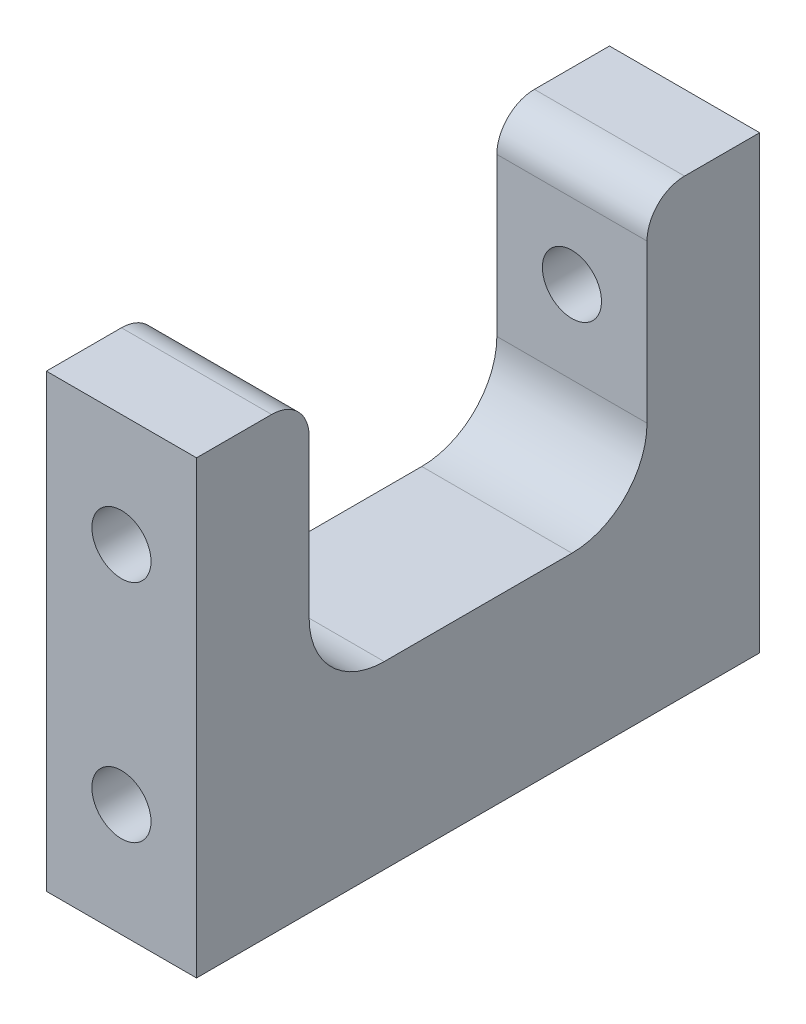
ISO-10303-21;
HEADER;
FILE_DESCRIPTION(('STEP AP214'),'2;1');
FILE_NAME('part.step','',(''),(''),'','','');
FILE_SCHEMA(('AUTOMOTIVE_DESIGN { 1 0 10303 214 1 1 1 1 }'));
ENDSEC;
DATA;
#1=APPLICATION_CONTEXT('core data for automotive mechanical design processes');
#2=APPLICATION_PROTOCOL_DEFINITION('international standard','automotive_design',2000,#1);
#3=PRODUCT_CONTEXT('',#1,'mechanical');
#4=PRODUCT('Part','Part','',(#3));
#5=PRODUCT_RELATED_PRODUCT_CATEGORY('part','',(#4));
#6=PRODUCT_DEFINITION_FORMATION('','',#4);
#7=PRODUCT_DEFINITION_CONTEXT('part definition',#1,'design');
#8=PRODUCT_DEFINITION('design','',#6,#7);
#9=PRODUCT_DEFINITION_SHAPE('','',#8);
#10=(LENGTH_UNIT() NAMED_UNIT(*) SI_UNIT(.MILLI.,.METRE.));
#11=(NAMED_UNIT(*) PLANE_ANGLE_UNIT() SI_UNIT($,.RADIAN.));
#12=(NAMED_UNIT(*) SI_UNIT($,.STERADIAN.) SOLID_ANGLE_UNIT());
#13=UNCERTAINTY_MEASURE_WITH_UNIT(LENGTH_MEASURE(1.E-05),#10,'distance_accuracy_value','');
#14=(GEOMETRIC_REPRESENTATION_CONTEXT(3) GLOBAL_UNCERTAINTY_ASSIGNED_CONTEXT((#13)) GLOBAL_UNIT_ASSIGNED_CONTEXT((#10,
#11,#12)) REPRESENTATION_CONTEXT('',''));
#15=CARTESIAN_POINT('',(0.,0.,0.));
#16=DIRECTION('',(0.,0.,1.));
#17=DIRECTION('',(1.,0.,0.));
#18=AXIS2_PLACEMENT_3D('',#15,#16,#17);
#19=CARTESIAN_POINT('',(-3.175,9.525,23.8125));
#20=DIRECTION('',(0.,-1.,0.));
#21=DIRECTION('',(0.,0.,-1.));
#22=AXIS2_PLACEMENT_3D('',#19,#20,#21);
#23=PLANE('',#22);
#24=DIRECTION('',(0.,0.,-1.));
#25=VECTOR('',#24,1.);
#26=CARTESIAN_POINT('',(3.175,9.525,23.8125));
#27=LINE('',#26,#25);
#28=CARTESIAN_POINT('',(3.175,9.525,23.8125));
#29=VERTEX_POINT('',#28);
#30=CARTESIAN_POINT('',(3.175,9.525,20.6375));
#31=VERTEX_POINT('',#30);
#32=EDGE_CURVE('E207',#29,#31,#27,.T.);
#33=ORIENTED_EDGE('',*,*,#32,.T.);
#34=DIRECTION('',(1.,0.,0.));
#35=VECTOR('',#34,1.);
#36=CARTESIAN_POINT('',(-3.175,9.525,20.6375));
#37=LINE('',#36,#35);
#38=CARTESIAN_POINT('',(-3.175,9.525,20.6375));
#39=VERTEX_POINT('',#38);
#40=EDGE_CURVE('E237',#31,#39,#37,.F.);
#41=ORIENTED_EDGE('',*,*,#40,.T.);
#42=DIRECTION('',(0.,0.,-1.));
#43=VECTOR('',#42,1.);
#44=CARTESIAN_POINT('',(-3.175,9.525,23.8125));
#45=LINE('',#44,#43);
#46=CARTESIAN_POINT('',(-3.175,9.525,23.8125));
#47=VERTEX_POINT('',#46);
#48=EDGE_CURVE('E203',#47,#39,#45,.T.);
#49=ORIENTED_EDGE('',*,*,#48,.F.);
#50=DIRECTION('',(-1.,0.,0.));
#51=VECTOR('',#50,1.);
#52=CARTESIAN_POINT('',(-3.175,9.525,23.8125));
#53=LINE('',#52,#51);
#54=EDGE_CURVE('E181',#29,#47,#53,.T.);
#55=ORIENTED_EDGE('',*,*,#54,.F.);
#56=EDGE_LOOP('',(#33,#41,#49,#55));
#57=FACE_BOUND('',#56,.T.);
#58=ADVANCED_FACE('F37',(#57),#23,.F.);
#59=CARTESIAN_POINT('',(3.175,-9.525,23.8125));
#60=DIRECTION('',(-1.,0.,0.));
#61=DIRECTION('',(0.,0.,1.));
#62=AXIS2_PLACEMENT_3D('',#59,#60,#61);
#63=PLANE('',#62);
#64=DIRECTION('',(0.,-1.,0.));
#65=VECTOR('',#64,1.);
#66=CARTESIAN_POINT('',(3.175,9.525,19.05));
#67=LINE('',#66,#65);
#68=CARTESIAN_POINT('',(3.175,7.9375,19.05));
#69=VERTEX_POINT('',#68);
#70=CARTESIAN_POINT('',(3.175,1.27,19.05));
#71=VERTEX_POINT('',#70);
#72=EDGE_CURVE('E163',#69,#71,#67,.T.);
#73=ORIENTED_EDGE('',*,*,#72,.F.);
#74=CARTESIAN_POINT('',(3.175,7.9375,20.6375));
#75=DIRECTION('',(-1.,0.,0.));
#76=DIRECTION('',(0.,0.,1.));
#77=AXIS2_PLACEMENT_3D('',#74,#75,#76);
#78=CIRCLE('',#77,1.5875);
#79=EDGE_CURVE('E235',#69,#31,#78,.F.);
#80=ORIENTED_EDGE('',*,*,#79,.T.);
#81=ORIENTED_EDGE('',*,*,#32,.F.);
#82=DIRECTION('',(0.,1.,0.));
#83=VECTOR('',#82,1.);
#84=CARTESIAN_POINT('',(3.175,-9.525,23.8125));
#85=LINE('',#84,#83);
#86=CARTESIAN_POINT('',(3.175,-9.525,23.8125));
#87=VERTEX_POINT('',#86);
#88=EDGE_CURVE('E178',#87,#29,#85,.T.);
#89=ORIENTED_EDGE('',*,*,#88,.F.);
#90=DIRECTION('',(0.,0.,-1.));
#91=VECTOR('',#90,1.);
#92=CARTESIAN_POINT('',(3.175,-9.525,23.8125));
#93=LINE('',#92,#91);
#94=CARTESIAN_POINT('',(3.175,-9.525,0.));
#95=VERTEX_POINT('',#94);
#96=EDGE_CURVE('E188',#87,#95,#93,.T.);
#97=ORIENTED_EDGE('',*,*,#96,.T.);
#98=DIRECTION('',(0.,1.,0.));
#99=VECTOR('',#98,1.);
#100=CARTESIAN_POINT('',(3.175,-9.525,0.));
#101=LINE('',#100,#99);
#102=CARTESIAN_POINT('',(3.175,9.525,0.));
#103=VERTEX_POINT('',#102);
#104=EDGE_CURVE('E172',#95,#103,#101,.T.);
#105=ORIENTED_EDGE('',*,*,#104,.T.);
#106=CARTESIAN_POINT('',(3.175,9.525,3.175));
#107=VERTEX_POINT('',#106);
#108=EDGE_CURVE('E206',#107,#103,#27,.T.);
#109=ORIENTED_EDGE('',*,*,#108,.F.);
#110=CARTESIAN_POINT('',(3.175,7.9375,3.175));
#111=DIRECTION('',(-1.,0.,0.));
#112=DIRECTION('',(0.,0.,1.));
#113=AXIS2_PLACEMENT_3D('',#110,#111,#112);
#114=CIRCLE('',#113,1.5875);
#115=CARTESIAN_POINT('',(3.175,7.9375,4.7625));
#116=VERTEX_POINT('',#115);
#117=EDGE_CURVE('E233',#107,#116,#114,.F.);
#118=ORIENTED_EDGE('',*,*,#117,.T.);
#119=DIRECTION('',(0.,1.,0.));
#120=VECTOR('',#119,1.);
#121=CARTESIAN_POINT('',(3.175,9.525,4.7625));
#122=LINE('',#121,#120);
#123=CARTESIAN_POINT('',(3.175,1.27,4.7625));
#124=VERTEX_POINT('',#123);
#125=EDGE_CURVE('E167',#124,#116,#122,.T.);
#126=ORIENTED_EDGE('',*,*,#125,.F.);
#127=CARTESIAN_POINT('',(3.175,1.27,7.9375));
#128=DIRECTION('',(-1.,0.,0.));
#129=DIRECTION('',(0.,0.,1.));
#130=AXIS2_PLACEMENT_3D('',#127,#128,#129);
#131=CIRCLE('',#130,3.175);
#132=CARTESIAN_POINT('',(3.175,-1.905,7.9375));
#133=VERTEX_POINT('',#132);
#134=EDGE_CURVE('E226',#124,#133,#131,.T.);
#135=ORIENTED_EDGE('',*,*,#134,.T.);
#136=DIRECTION('',(0.,0.,-1.));
#137=VECTOR('',#136,1.);
#138=CARTESIAN_POINT('',(3.175,-1.905,19.05));
#139=LINE('',#138,#137);
#140=CARTESIAN_POINT('',(3.175,-1.905,15.875));
#141=VERTEX_POINT('',#140);
#142=EDGE_CURVE('E174',#141,#133,#139,.T.);
#143=ORIENTED_EDGE('',*,*,#142,.F.);
#144=CARTESIAN_POINT('',(3.175,1.27,15.875));
#145=DIRECTION('',(-1.,0.,0.));
#146=DIRECTION('',(0.,0.,1.));
#147=AXIS2_PLACEMENT_3D('',#144,#145,#146);
#148=CIRCLE('',#147,3.175);
#149=EDGE_CURVE('E221',#141,#71,#148,.T.);
#150=ORIENTED_EDGE('',*,*,#149,.T.);
#151=EDGE_LOOP('',(#73,#80,#81,#89,#97,#105,#109,#118,#126,#135,#143,#150));
#152=FACE_BOUND('',#151,.T.);
#153=ADVANCED_FACE('F250',(#152),#63,.F.);
#154=CARTESIAN_POINT('',(-3.175,9.525,3.175));
#155=VERTEX_POINT('',#154);
#156=CARTESIAN_POINT('',(-3.175,9.525,0.));
#157=VERTEX_POINT('',#156);
#158=EDGE_CURVE('E202',#155,#157,#45,.T.);
#159=ORIENTED_EDGE('',*,*,#158,.F.);
#160=DIRECTION('',(1.,0.,0.));
#161=VECTOR('',#160,1.);
#162=CARTESIAN_POINT('',(-3.175,9.525,3.175));
#163=LINE('',#162,#161);
#164=EDGE_CURVE('E45',#155,#107,#163,.T.);
#165=ORIENTED_EDGE('',*,*,#164,.T.);
#166=ORIENTED_EDGE('',*,*,#108,.T.);
#167=DIRECTION('',(-1.,0.,0.));
#168=VECTOR('',#167,1.);
#169=CARTESIAN_POINT('',(-3.175,9.525,0.));
#170=LINE('',#169,#168);
#171=EDGE_CURVE('E191',#103,#157,#170,.T.);
#172=ORIENTED_EDGE('',*,*,#171,.T.);
#173=EDGE_LOOP('',(#159,#165,#166,#172));
#174=FACE_BOUND('',#173,.T.);
#175=ADVANCED_FACE('F245',(#174),#23,.F.);
#176=CARTESIAN_POINT('',(-3.175,-9.525,23.8125));
#177=DIRECTION('',(1.,0.,0.));
#178=DIRECTION('',(0.,0.,-1.));
#179=AXIS2_PLACEMENT_3D('',#176,#177,#178);
#180=PLANE('',#179);
#181=ORIENTED_EDGE('',*,*,#48,.T.);
#182=CARTESIAN_POINT('',(-3.175,7.9375,20.6375));
#183=DIRECTION('',(1.,0.,0.));
#184=DIRECTION('',(0.,0.,-1.));
#185=AXIS2_PLACEMENT_3D('',#182,#183,#184);
#186=CIRCLE('',#185,1.5875);
#187=CARTESIAN_POINT('',(-3.175,7.9375,19.05));
#188=VERTEX_POINT('',#187);
#189=EDGE_CURVE('E240',#39,#188,#186,.F.);
#190=ORIENTED_EDGE('',*,*,#189,.T.);
#191=DIRECTION('',(0.,-1.,0.));
#192=VECTOR('',#191,1.);
#193=CARTESIAN_POINT('',(-3.175,9.525,19.05));
#194=LINE('',#193,#192);
#195=CARTESIAN_POINT('',(-3.175,1.27,19.05));
#196=VERTEX_POINT('',#195);
#197=EDGE_CURVE('E164',#188,#196,#194,.T.);
#198=ORIENTED_EDGE('',*,*,#197,.T.);
#199=CARTESIAN_POINT('',(-3.175,1.27,15.875));
#200=DIRECTION('',(1.,0.,0.));
#201=DIRECTION('',(0.,0.,-1.));
#202=AXIS2_PLACEMENT_3D('',#199,#200,#201);
#203=CIRCLE('',#202,3.175);
#204=CARTESIAN_POINT('',(-3.175,-1.905,15.875));
#205=VERTEX_POINT('',#204);
#206=EDGE_CURVE('E224',#196,#205,#203,.T.);
#207=ORIENTED_EDGE('',*,*,#206,.T.);
#208=DIRECTION('',(0.,0.,-1.));
#209=VECTOR('',#208,1.);
#210=CARTESIAN_POINT('',(-3.175,-1.905,19.05));
#211=LINE('',#210,#209);
#212=CARTESIAN_POINT('',(-3.175,-1.905,7.9375));
#213=VERTEX_POINT('',#212);
#214=EDGE_CURVE('E166',#205,#213,#211,.T.);
#215=ORIENTED_EDGE('',*,*,#214,.T.);
#216=CARTESIAN_POINT('',(-3.175,1.27,7.9375));
#217=DIRECTION('',(1.,0.,0.));
#218=DIRECTION('',(0.,0.,-1.));
#219=AXIS2_PLACEMENT_3D('',#216,#217,#218);
#220=CIRCLE('',#219,3.175);
#221=CARTESIAN_POINT('',(-3.175,1.27,4.7625));
#222=VERTEX_POINT('',#221);
#223=EDGE_CURVE('E228',#213,#222,#220,.T.);
#224=ORIENTED_EDGE('',*,*,#223,.T.);
#225=DIRECTION('',(0.,1.,0.));
#226=VECTOR('',#225,1.);
#227=CARTESIAN_POINT('',(-3.175,9.525,4.7625));
#228=LINE('',#227,#226);
#229=CARTESIAN_POINT('',(-3.175,7.9375,4.7625));
#230=VERTEX_POINT('',#229);
#231=EDGE_CURVE('E170',#222,#230,#228,.T.);
#232=ORIENTED_EDGE('',*,*,#231,.T.);
#233=CARTESIAN_POINT('',(-3.175,7.9375,3.175));
#234=DIRECTION('',(1.,0.,0.));
#235=DIRECTION('',(0.,0.,-1.));
#236=AXIS2_PLACEMENT_3D('',#233,#234,#235);
#237=CIRCLE('',#236,1.5875);
#238=EDGE_CURVE('E52',#230,#155,#237,.F.);
#239=ORIENTED_EDGE('',*,*,#238,.T.);
#240=ORIENTED_EDGE('',*,*,#158,.T.);
#241=DIRECTION('',(0.,-1.,0.));
#242=VECTOR('',#241,1.);
#243=CARTESIAN_POINT('',(-3.175,-9.525,0.));
#244=LINE('',#243,#242);
#245=CARTESIAN_POINT('',(-3.175,-9.525,0.));
#246=VERTEX_POINT('',#245);
#247=EDGE_CURVE('E194',#157,#246,#244,.T.);
#248=ORIENTED_EDGE('',*,*,#247,.T.);
#249=DIRECTION('',(0.,0.,-1.));
#250=VECTOR('',#249,1.);
#251=CARTESIAN_POINT('',(-3.175,-9.525,23.8125));
#252=LINE('',#251,#250);
#253=CARTESIAN_POINT('',(-3.175,-9.525,23.8125));
#254=VERTEX_POINT('',#253);
#255=EDGE_CURVE('E199',#254,#246,#252,.T.);
#256=ORIENTED_EDGE('',*,*,#255,.F.);
#257=DIRECTION('',(0.,-1.,0.));
#258=VECTOR('',#257,1.);
#259=CARTESIAN_POINT('',(-3.175,-9.525,23.8125));
#260=LINE('',#259,#258);
#261=EDGE_CURVE('E184',#47,#254,#260,.T.);
#262=ORIENTED_EDGE('',*,*,#261,.F.);
#263=EDGE_LOOP('',(#181,#190,#198,#207,#215,#224,#232,#239,#240,#248,#256,#262));
#264=FACE_BOUND('',#263,.T.);
#265=ADVANCED_FACE('F260',(#264),#180,.F.);
#266=CARTESIAN_POINT('',(-3.175,-9.525,23.8125));
#267=DIRECTION('',(0.,1.,0.));
#268=DIRECTION('',(0.,0.,1.));
#269=AXIS2_PLACEMENT_3D('',#266,#267,#268);
#270=PLANE('',#269);
#271=DIRECTION('',(1.,0.,0.));
#272=VECTOR('',#271,1.);
#273=CARTESIAN_POINT('',(-3.175,-9.525,0.));
#274=LINE('',#273,#272);
#275=EDGE_CURVE('E182',#246,#95,#274,.T.);
#276=ORIENTED_EDGE('',*,*,#275,.T.);
#277=ORIENTED_EDGE('',*,*,#96,.F.);
#278=DIRECTION('',(1.,0.,0.));
#279=VECTOR('',#278,1.);
#280=CARTESIAN_POINT('',(-3.175,-9.525,23.8125));
#281=LINE('',#280,#279);
#282=EDGE_CURVE('E186',#254,#87,#281,.T.);
#283=ORIENTED_EDGE('',*,*,#282,.F.);
#284=ORIENTED_EDGE('',*,*,#255,.T.);
#285=EDGE_LOOP('',(#276,#277,#283,#284));
#286=FACE_BOUND('',#285,.T.);
#287=ADVANCED_FACE('F264',(#286),#270,.F.);
#288=CARTESIAN_POINT('',(0.,0.,23.8125));
#289=DIRECTION('',(0.,0.,-1.));
#290=DIRECTION('',(-1.,0.,0.));
#291=AXIS2_PLACEMENT_3D('',#288,#289,#290);
#292=PLANE('',#291);
#293=CARTESIAN_POINT('',(0.,-4.7625,23.8125));
#294=DIRECTION('',(0.,0.,1.));
#295=DIRECTION('',(1.,0.,0.));
#296=AXIS2_PLACEMENT_3D('',#293,#294,#295);
#297=CIRCLE('',#296,1.24999999999999);
#298=CARTESIAN_POINT('',(1.24999999999999,-4.7625,23.8125));
#299=VERTEX_POINT('',#298);
#300=EDGE_CURVE('E151',#299,#299,#297,.T.);
#301=ORIENTED_EDGE('',*,*,#300,.F.);
#302=EDGE_LOOP('',(#301));
#303=FACE_BOUND('',#302,.T.);
#304=CARTESIAN_POINT('',(0.,4.7625,23.8125));
#305=DIRECTION('',(0.,0.,1.));
#306=DIRECTION('',(1.,0.,0.));
#307=AXIS2_PLACEMENT_3D('',#304,#305,#306);
#308=CIRCLE('',#307,1.24999999999999);
#309=CARTESIAN_POINT('',(1.24999999999999,4.7625,23.8125));
#310=VERTEX_POINT('',#309);
#311=EDGE_CURVE('E157',#310,#310,#308,.T.);
#312=ORIENTED_EDGE('',*,*,#311,.F.);
#313=EDGE_LOOP('',(#312));
#314=FACE_BOUND('',#313,.T.);
#315=ORIENTED_EDGE('',*,*,#88,.T.);
#316=ORIENTED_EDGE('',*,*,#54,.T.);
#317=ORIENTED_EDGE('',*,*,#261,.T.);
#318=ORIENTED_EDGE('',*,*,#282,.T.);
#319=EDGE_LOOP('',(#315,#316,#317,#318));
#320=FACE_BOUND('',#319,.T.);
#321=ADVANCED_FACE('F266',(#303,#314,#320),#292,.F.);
#322=CARTESIAN_POINT('',(0.,0.,0.));
#323=DIRECTION('',(0.,0.,-1.));
#324=DIRECTION('',(-1.,0.,0.));
#325=AXIS2_PLACEMENT_3D('',#322,#323,#324);
#326=PLANE('',#325);
#327=CARTESIAN_POINT('',(0.,-4.7625,0.));
#328=DIRECTION('',(0.,0.,-1.));
#329=DIRECTION('',(-1.,0.,0.));
#330=AXIS2_PLACEMENT_3D('',#327,#328,#329);
#331=CIRCLE('',#330,1.24999999999999);
#332=CARTESIAN_POINT('',(-1.24999999999999,-4.7625,0.));
#333=VERTEX_POINT('',#332);
#334=EDGE_CURVE('E141',#333,#333,#331,.T.);
#335=ORIENTED_EDGE('',*,*,#334,.F.);
#336=EDGE_LOOP('',(#335));
#337=FACE_BOUND('',#336,.T.);
#338=CARTESIAN_POINT('',(0.,4.7625,0.));
#339=DIRECTION('',(0.,0.,-1.));
#340=DIRECTION('',(-1.,0.,0.));
#341=AXIS2_PLACEMENT_3D('',#338,#339,#340);
#342=CIRCLE('',#341,1.24999999999999);
#343=CARTESIAN_POINT('',(-1.24999999999999,4.7625,0.));
#344=VERTEX_POINT('',#343);
#345=EDGE_CURVE('E140',#344,#344,#342,.T.);
#346=ORIENTED_EDGE('',*,*,#345,.F.);
#347=EDGE_LOOP('',(#346));
#348=FACE_BOUND('',#347,.T.);
#349=ORIENTED_EDGE('',*,*,#104,.F.);
#350=ORIENTED_EDGE('',*,*,#275,.F.);
#351=ORIENTED_EDGE('',*,*,#247,.F.);
#352=ORIENTED_EDGE('',*,*,#171,.F.);
#353=EDGE_LOOP('',(#349,#350,#351,#352));
#354=FACE_BOUND('',#353,.T.);
#355=ADVANCED_FACE('F257',(#337,#348,#354),#326,.T.);
#356=CARTESIAN_POINT('',(-3.175,9.525,19.05));
#357=DIRECTION('',(0.,0.,1.));
#358=DIRECTION('',(1.,0.,0.));
#359=AXIS2_PLACEMENT_3D('',#356,#357,#358);
#360=PLANE('',#359);
#361=CARTESIAN_POINT('',(0.,4.7625,19.05));
#362=DIRECTION('',(0.,0.,1.));
#363=DIRECTION('',(1.,0.,0.));
#364=AXIS2_PLACEMENT_3D('',#361,#362,#363);
#365=CIRCLE('',#364,1.24999999999999);
#366=CARTESIAN_POINT('',(1.24999999999999,4.7625,19.05));
#367=VERTEX_POINT('',#366);
#368=EDGE_CURVE('E160',#367,#367,#365,.T.);
#369=ORIENTED_EDGE('',*,*,#368,.T.);
#370=EDGE_LOOP('',(#369));
#371=FACE_BOUND('',#370,.T.);
#372=ORIENTED_EDGE('',*,*,#197,.F.);
#373=DIRECTION('',(1.,0.,0.));
#374=VECTOR('',#373,1.);
#375=CARTESIAN_POINT('',(-3.175,7.9375,19.05));
#376=LINE('',#375,#374);
#377=EDGE_CURVE('E230',#188,#69,#376,.T.);
#378=ORIENTED_EDGE('',*,*,#377,.T.);
#379=ORIENTED_EDGE('',*,*,#72,.T.);
#380=DIRECTION('',(1.,0.,0.));
#381=VECTOR('',#380,1.);
#382=CARTESIAN_POINT('',(-3.175,1.27,19.05));
#383=LINE('',#382,#381);
#384=EDGE_CURVE('E215',#71,#196,#383,.F.);
#385=ORIENTED_EDGE('',*,*,#384,.T.);
#386=EDGE_LOOP('',(#372,#378,#379,#385));
#387=FACE_BOUND('',#386,.T.);
#388=ADVANCED_FACE('F277',(#371,#387),#360,.F.);
#389=CARTESIAN_POINT('',(-3.175,9.525,4.7625));
#390=DIRECTION('',(0.,0.,-1.));
#391=DIRECTION('',(0.,1.,0.));
#392=AXIS2_PLACEMENT_3D('',#389,#390,#391);
#393=PLANE('',#392);
#394=CARTESIAN_POINT('',(0.,4.7625,4.7625));
#395=DIRECTION('',(0.,0.,-1.));
#396=DIRECTION('',(0.,1.,0.));
#397=AXIS2_PLACEMENT_3D('',#394,#395,#396);
#398=CIRCLE('',#397,1.24999999999999);
#399=CARTESIAN_POINT('',(0.,6.01249999999999,4.7625));
#400=VERTEX_POINT('',#399);
#401=EDGE_CURVE('E144',#400,#400,#398,.T.);
#402=ORIENTED_EDGE('',*,*,#401,.T.);
#403=EDGE_LOOP('',(#402));
#404=FACE_BOUND('',#403,.T.);
#405=ORIENTED_EDGE('',*,*,#125,.T.);
#406=DIRECTION('',(1.,0.,0.));
#407=VECTOR('',#406,1.);
#408=CARTESIAN_POINT('',(-3.175,7.9375,4.7625));
#409=LINE('',#408,#407);
#410=EDGE_CURVE('E11',#116,#230,#409,.F.);
#411=ORIENTED_EDGE('',*,*,#410,.T.);
#412=ORIENTED_EDGE('',*,*,#231,.F.);
#413=DIRECTION('',(1.,0.,0.));
#414=VECTOR('',#413,1.);
#415=CARTESIAN_POINT('',(3.175,1.27,4.7625));
#416=LINE('',#415,#414);
#417=EDGE_CURVE('E218',#222,#124,#416,.T.);
#418=ORIENTED_EDGE('',*,*,#417,.T.);
#419=EDGE_LOOP('',(#405,#411,#412,#418));
#420=FACE_BOUND('',#419,.T.);
#421=ADVANCED_FACE('F292',(#404,#420),#393,.F.);
#422=CARTESIAN_POINT('',(-3.175,-1.905,19.05));
#423=DIRECTION('',(0.,-1.,0.));
#424=DIRECTION('',(0.,0.,-1.));
#425=AXIS2_PLACEMENT_3D('',#422,#423,#424);
#426=PLANE('',#425);
#427=ORIENTED_EDGE('',*,*,#214,.F.);
#428=DIRECTION('',(1.,0.,0.));
#429=VECTOR('',#428,1.);
#430=CARTESIAN_POINT('',(3.175,-1.905,15.875));
#431=LINE('',#430,#429);
#432=EDGE_CURVE('E212',#205,#141,#431,.T.);
#433=ORIENTED_EDGE('',*,*,#432,.T.);
#434=ORIENTED_EDGE('',*,*,#142,.T.);
#435=DIRECTION('',(1.,0.,0.));
#436=VECTOR('',#435,1.);
#437=CARTESIAN_POINT('',(-3.175,-1.905,7.9375));
#438=LINE('',#437,#436);
#439=EDGE_CURVE('E210',#133,#213,#438,.F.);
#440=ORIENTED_EDGE('',*,*,#439,.T.);
#441=EDGE_LOOP('',(#427,#433,#434,#440));
#442=FACE_BOUND('',#441,.T.);
#443=ADVANCED_FACE('F287',(#442),#426,.F.);
#444=CARTESIAN_POINT('',(0.,4.7625,23.8125));
#445=DIRECTION('',(0.,0.,1.));
#446=DIRECTION('',(1.,0.,0.));
#447=AXIS2_PLACEMENT_3D('',#444,#445,#446);
#448=CYLINDRICAL_SURFACE('',#447,1.24999999999999);
#449=ORIENTED_EDGE('',*,*,#311,.T.);
#450=EDGE_LOOP('',(#449));
#451=FACE_BOUND('',#450,.T.);
#452=ORIENTED_EDGE('',*,*,#368,.F.);
#453=EDGE_LOOP('',(#452));
#454=FACE_BOUND('',#453,.T.);
#455=ADVANCED_FACE('F324',(#451,#454),#448,.F.);
#456=CARTESIAN_POINT('',(0.,-4.7625,13.9065));
#457=DIRECTION('',(0.,0.,1.));
#458=DIRECTION('',(1.,0.,0.));
#459=AXIS2_PLACEMENT_3D('',#456,#457,#458);
#460=CONICAL_SURFACE('',#459,1.25,1.02974425867665);
#461=CARTESIAN_POINT('',(0.,-4.7625,13.1554242262155));
#462=VERTEX_POINT('',#461);
#463=VERTEX_LOOP('',#462);
#464=FACE_BOUND('',#463,.T.);
#465=CARTESIAN_POINT('',(0.,-4.7625,13.9065));
#466=DIRECTION('',(0.,0.,1.));
#467=DIRECTION('',(1.,0.,0.));
#468=AXIS2_PLACEMENT_3D('',#465,#466,#467);
#469=CIRCLE('',#468,1.25);
#470=CARTESIAN_POINT('',(1.25,-4.7625,13.9065));
#471=VERTEX_POINT('',#470);
#472=EDGE_CURVE('E154',#471,#471,#469,.T.);
#473=ORIENTED_EDGE('',*,*,#472,.T.);
#474=EDGE_LOOP('',(#473));
#475=FACE_BOUND('',#474,.T.);
#476=ADVANCED_FACE('F330',(#464,#475),#460,.F.);
#477=CARTESIAN_POINT('',(0.,-4.7625,23.8125));
#478=DIRECTION('',(0.,0.,1.));
#479=DIRECTION('',(1.,0.,0.));
#480=AXIS2_PLACEMENT_3D('',#477,#478,#479);
#481=CYLINDRICAL_SURFACE('',#480,1.24999999999999);
#482=ORIENTED_EDGE('',*,*,#472,.F.);
#483=EDGE_LOOP('',(#482));
#484=FACE_BOUND('',#483,.T.);
#485=ORIENTED_EDGE('',*,*,#300,.T.);
#486=EDGE_LOOP('',(#485));
#487=FACE_BOUND('',#486,.T.);
#488=ADVANCED_FACE('F334',(#484,#487),#481,.F.);
#489=CARTESIAN_POINT('',(0.,4.7625,0.));
#490=DIRECTION('',(0.,0.,-1.));
#491=DIRECTION('',(-1.,0.,0.));
#492=AXIS2_PLACEMENT_3D('',#489,#490,#491);
#493=CYLINDRICAL_SURFACE('',#492,1.24999999999999);
#494=ORIENTED_EDGE('',*,*,#345,.T.);
#495=EDGE_LOOP('',(#494));
#496=FACE_BOUND('',#495,.T.);
#497=ORIENTED_EDGE('',*,*,#401,.F.);
#498=EDGE_LOOP('',(#497));
#499=FACE_BOUND('',#498,.T.);
#500=ADVANCED_FACE('F134',(#496,#499),#493,.F.);
#501=CARTESIAN_POINT('',(0.,-4.7625,9.906));
#502=DIRECTION('',(0.,0.,-1.));
#503=DIRECTION('',(-1.,0.,0.));
#504=AXIS2_PLACEMENT_3D('',#501,#502,#503);
#505=CONICAL_SURFACE('',#504,1.25,1.02974425867665);
#506=CARTESIAN_POINT('',(0.,-4.7625,10.6570757737845));
#507=VERTEX_POINT('',#506);
#508=VERTEX_LOOP('',#507);
#509=FACE_BOUND('',#508,.T.);
#510=CARTESIAN_POINT('',(0.,-4.7625,9.906));
#511=DIRECTION('',(0.,0.,-1.));
#512=DIRECTION('',(-1.,0.,0.));
#513=AXIS2_PLACEMENT_3D('',#510,#511,#512);
#514=CIRCLE('',#513,1.25);
#515=CARTESIAN_POINT('',(-1.25,-4.7625,9.906));
#516=VERTEX_POINT('',#515);
#517=EDGE_CURVE('E138',#516,#516,#514,.T.);
#518=ORIENTED_EDGE('',*,*,#517,.T.);
#519=EDGE_LOOP('',(#518));
#520=FACE_BOUND('',#519,.T.);
#521=ADVANCED_FACE('F130',(#509,#520),#505,.F.);
#522=CARTESIAN_POINT('',(0.,-4.7625,0.));
#523=DIRECTION('',(0.,0.,-1.));
#524=DIRECTION('',(-1.,0.,0.));
#525=AXIS2_PLACEMENT_3D('',#522,#523,#524);
#526=CYLINDRICAL_SURFACE('',#525,1.24999999999999);
#527=ORIENTED_EDGE('',*,*,#517,.F.);
#528=EDGE_LOOP('',(#527));
#529=FACE_BOUND('',#528,.T.);
#530=ORIENTED_EDGE('',*,*,#334,.T.);
#531=EDGE_LOOP('',(#530));
#532=FACE_BOUND('',#531,.T.);
#533=ADVANCED_FACE('F133',(#529,#532),#526,.F.);
#534=CARTESIAN_POINT('',(-3.175,1.27,15.875));
#535=DIRECTION('',(-1.,0.,0.));
#536=DIRECTION('',(0.,0.,1.));
#537=AXIS2_PLACEMENT_3D('',#534,#535,#536);
#538=CYLINDRICAL_SURFACE('',#537,3.175);
#539=ORIENTED_EDGE('',*,*,#206,.F.);
#540=ORIENTED_EDGE('',*,*,#384,.F.);
#541=ORIENTED_EDGE('',*,*,#149,.F.);
#542=ORIENTED_EDGE('',*,*,#432,.F.);
#543=EDGE_LOOP('',(#539,#540,#541,#542));
#544=FACE_BOUND('',#543,.T.);
#545=ADVANCED_FACE('F283',(#544),#538,.F.);
#546=CARTESIAN_POINT('',(-3.175,1.27,7.9375));
#547=DIRECTION('',(-1.,0.,0.));
#548=DIRECTION('',(0.,0.,1.));
#549=AXIS2_PLACEMENT_3D('',#546,#547,#548);
#550=CYLINDRICAL_SURFACE('',#549,3.175);
#551=ORIENTED_EDGE('',*,*,#223,.F.);
#552=ORIENTED_EDGE('',*,*,#439,.F.);
#553=ORIENTED_EDGE('',*,*,#134,.F.);
#554=ORIENTED_EDGE('',*,*,#417,.F.);
#555=EDGE_LOOP('',(#551,#552,#553,#554));
#556=FACE_BOUND('',#555,.T.);
#557=ADVANCED_FACE('F290',(#556),#550,.F.);
#558=CARTESIAN_POINT('',(-3.175,7.9375,20.6375));
#559=DIRECTION('',(1.,0.,0.));
#560=DIRECTION('',(0.,0.,-1.));
#561=AXIS2_PLACEMENT_3D('',#558,#559,#560);
#562=CYLINDRICAL_SURFACE('',#561,1.5875);
#563=ORIENTED_EDGE('',*,*,#189,.F.);
#564=ORIENTED_EDGE('',*,*,#40,.F.);
#565=ORIENTED_EDGE('',*,*,#79,.F.);
#566=ORIENTED_EDGE('',*,*,#377,.F.);
#567=EDGE_LOOP('',(#563,#564,#565,#566));
#568=FACE_BOUND('',#567,.T.);
#569=ADVANCED_FACE('F275',(#568),#562,.T.);
#570=CARTESIAN_POINT('',(-3.175,7.9375,3.175));
#571=DIRECTION('',(1.,0.,0.));
#572=DIRECTION('',(0.,0.,-1.));
#573=AXIS2_PLACEMENT_3D('',#570,#571,#572);
#574=CYLINDRICAL_SURFACE('',#573,1.5875);
#575=ORIENTED_EDGE('',*,*,#238,.F.);
#576=ORIENTED_EDGE('',*,*,#410,.F.);
#577=ORIENTED_EDGE('',*,*,#117,.F.);
#578=ORIENTED_EDGE('',*,*,#164,.F.);
#579=EDGE_LOOP('',(#575,#576,#577,#578));
#580=FACE_BOUND('',#579,.T.);
#581=ADVANCED_FACE('F39',(#580),#574,.T.);
#582=CLOSED_SHELL('',(#58,#153,#175,#265,#287,#321,#355,#388,#421,#443,#455,#476,#488,#500,#521,
#533,#545,#557,#569,#581));
#583=MANIFOLD_SOLID_BREP('B2',#582);
#584=ADVANCED_BREP_SHAPE_REPRESENTATION('',(#18,#583),#14);
#585=SHAPE_DEFINITION_REPRESENTATION(#9,#584);
ENDSEC;
END-ISO-10303-21;
